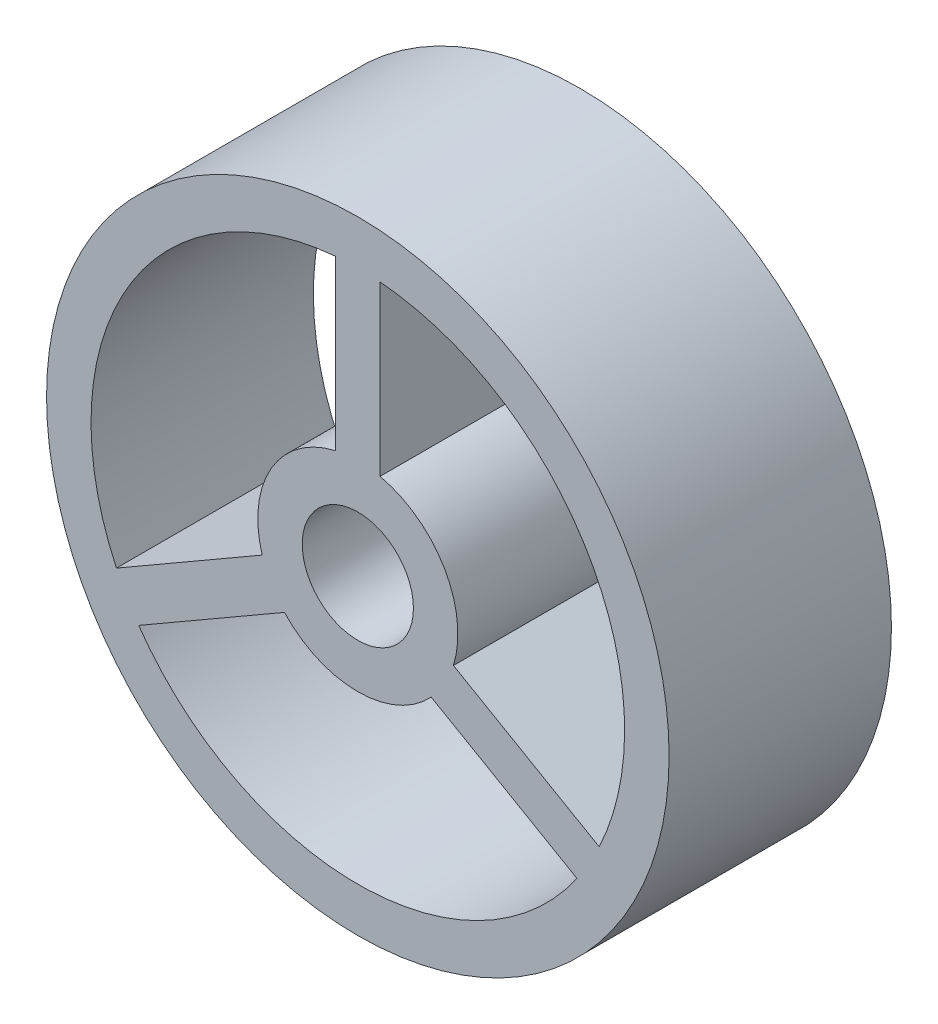
ISO-10303-21;
HEADER;
FILE_DESCRIPTION(('STEP AP214'),'2;1');
FILE_NAME('part.step','',(''),(''),'','','');
FILE_SCHEMA(('AUTOMOTIVE_DESIGN { 1 0 10303 214 1 1 1 1 }'));
ENDSEC;
DATA;
#1=APPLICATION_CONTEXT('core data for automotive mechanical design processes');
#2=APPLICATION_PROTOCOL_DEFINITION('international standard','automotive_design',2000,#1);
#3=PRODUCT_CONTEXT('',#1,'mechanical');
#4=PRODUCT('Part','Part','',(#3));
#5=PRODUCT_RELATED_PRODUCT_CATEGORY('part','',(#4));
#6=PRODUCT_DEFINITION_FORMATION('','',#4);
#7=PRODUCT_DEFINITION_CONTEXT('part definition',#1,'design');
#8=PRODUCT_DEFINITION('design','',#6,#7);
#9=PRODUCT_DEFINITION_SHAPE('','',#8);
#10=(LENGTH_UNIT() NAMED_UNIT(*) SI_UNIT(.MILLI.,.METRE.));
#11=(NAMED_UNIT(*) PLANE_ANGLE_UNIT() SI_UNIT($,.RADIAN.));
#12=(NAMED_UNIT(*) SI_UNIT($,.STERADIAN.) SOLID_ANGLE_UNIT());
#13=UNCERTAINTY_MEASURE_WITH_UNIT(LENGTH_MEASURE(1.E-05),#10,'distance_accuracy_value','');
#14=(GEOMETRIC_REPRESENTATION_CONTEXT(3) GLOBAL_UNCERTAINTY_ASSIGNED_CONTEXT((#13)) GLOBAL_UNIT_ASSIGNED_CONTEXT((#10,
#11,#12)) REPRESENTATION_CONTEXT('',''));
#15=CARTESIAN_POINT('',(0.,0.,0.));
#16=DIRECTION('',(0.,0.,1.));
#17=DIRECTION('',(1.,0.,0.));
#18=AXIS2_PLACEMENT_3D('',#15,#16,#17);
#19=CARTESIAN_POINT('',(0.,0.,10.));
#20=DIRECTION('',(0.,0.,-1.));
#21=DIRECTION('',(-1.,0.,0.));
#22=AXIS2_PLACEMENT_3D('',#19,#20,#21);
#23=CYLINDRICAL_SURFACE('',#22,14.);
#24=CARTESIAN_POINT('',(0.,0.,10.));
#25=DIRECTION('',(0.,0.,1.));
#26=DIRECTION('',(1.,0.,0.));
#27=AXIS2_PLACEMENT_3D('',#24,#25,#26);
#28=CIRCLE('',#27,14.);
#29=CARTESIAN_POINT('',(14.,0.,10.));
#30=VERTEX_POINT('',#29);
#31=EDGE_CURVE('E12',#30,#30,#28,.T.);
#32=ORIENTED_EDGE('',*,*,#31,.F.);
#33=EDGE_LOOP('',(#32));
#34=FACE_BOUND('',#33,.T.);
#35=CARTESIAN_POINT('',(0.,0.,0.));
#36=DIRECTION('',(0.,0.,1.));
#37=DIRECTION('',(1.,0.,0.));
#38=AXIS2_PLACEMENT_3D('',#35,#36,#37);
#39=CIRCLE('',#38,14.);
#40=CARTESIAN_POINT('',(14.,0.,0.));
#41=VERTEX_POINT('',#40);
#42=EDGE_CURVE('E84',#41,#41,#39,.T.);
#43=ORIENTED_EDGE('',*,*,#42,.T.);
#44=EDGE_LOOP('',(#43));
#45=FACE_BOUND('',#44,.T.);
#46=ADVANCED_FACE('F81',(#34,#45),#23,.T.);
#47=CARTESIAN_POINT('',(0.,0.,10.));
#48=DIRECTION('',(0.,0.,1.));
#49=DIRECTION('',(1.,0.,0.));
#50=AXIS2_PLACEMENT_3D('',#47,#48,#49);
#51=PLANE('',#50);
#52=DIRECTION('',(0.866025403784439,-0.5,0.));
#53=VECTOR('',#52,1.);
#54=CARTESIAN_POINT('',(0.500000000000267,0.866025403784901,10.));
#55=LINE('',#54,#53);
#56=CARTESIAN_POINT('',(4.29967103839308,-1.32771569306321,10.));
#57=VERTEX_POINT('',#56);
#58=CARTESIAN_POINT('',(10.8561575886042,-5.11310496776579,10.));
#59=VERTEX_POINT('',#58);
#60=EDGE_CURVE('E95',#57,#59,#55,.T.);
#61=ORIENTED_EDGE('',*,*,#60,.F.);
#62=CARTESIAN_POINT('',(0.,0.,10.));
#63=DIRECTION('',(0.,0.,1.));
#64=DIRECTION('',(1.,0.,0.));
#65=AXIS2_PLACEMENT_3D('',#62,#63,#64);
#66=CIRCLE('',#65,4.5);
#67=CARTESIAN_POINT('',(0.999999999999998,4.38748219369606,10.));
#68=VERTEX_POINT('',#67);
#69=EDGE_CURVE('E211',#57,#68,#66,.T.);
#70=ORIENTED_EDGE('',*,*,#69,.T.);
#71=DIRECTION('',(0.,1.,0.));
#72=VECTOR('',#71,1.);
#73=CARTESIAN_POINT('',(0.999999999999997,0.,10.));
#74=LINE('',#73,#72);
#75=CARTESIAN_POINT('',(1.,11.9582607431014,10.));
#76=VERTEX_POINT('',#75);
#77=EDGE_CURVE('E224',#68,#76,#74,.T.);
#78=ORIENTED_EDGE('',*,*,#77,.T.);
#79=CARTESIAN_POINT('',(0.,0.,10.));
#80=DIRECTION('',(0.,0.,1.));
#81=DIRECTION('',(1.,0.,0.));
#82=AXIS2_PLACEMENT_3D('',#79,#80,#81);
#83=CIRCLE('',#82,12.);
#84=EDGE_CURVE('E221',#59,#76,#83,.T.);
#85=ORIENTED_EDGE('',*,*,#84,.F.);
#86=EDGE_LOOP('',(#61,#70,#78,#85));
#87=FACE_BOUND('',#86,.T.);
#88=DIRECTION('',(-0.866025403784439,-0.5,0.));
#89=VECTOR('',#88,1.);
#90=CARTESIAN_POINT('',(0.500000000000206,-0.866025403784794,10.));
#91=LINE('',#90,#89);
#92=CARTESIAN_POINT('',(-3.29967103839213,-3.05976650063264,10.));
#93=VERTEX_POINT('',#92);
#94=CARTESIAN_POINT('',(-9.85615758860374,-6.8451557753355,10.));
#95=VERTEX_POINT('',#94);
#96=EDGE_CURVE('E103',#93,#95,#91,.T.);
#97=ORIENTED_EDGE('',*,*,#96,.F.);
#98=CARTESIAN_POINT('',(0.,0.,10.));
#99=DIRECTION('',(0.,0.,1.));
#100=DIRECTION('',(1.,0.,0.));
#101=AXIS2_PLACEMENT_3D('',#98,#99,#100);
#102=CIRCLE('',#101,4.5);
#103=CARTESIAN_POINT('',(3.29967103839308,-3.05976650063209,10.));
#104=VERTEX_POINT('',#103);
#105=EDGE_CURVE('E189',#93,#104,#102,.T.);
#106=ORIENTED_EDGE('',*,*,#105,.T.);
#107=DIRECTION('',(0.866025403784439,-0.5,0.));
#108=VECTOR('',#107,1.);
#109=CARTESIAN_POINT('',(-0.499999999999733,-0.866025403783976,10.));
#110=LINE('',#109,#108);
#111=CARTESIAN_POINT('',(9.8561575886044,-6.84515577533476,10.));
#112=VERTEX_POINT('',#111);
#113=EDGE_CURVE('E192',#104,#112,#110,.T.);
#114=ORIENTED_EDGE('',*,*,#113,.T.);
#115=CARTESIAN_POINT('',(0.,0.,10.));
#116=DIRECTION('',(0.,0.,1.));
#117=DIRECTION('',(1.,0.,0.));
#118=AXIS2_PLACEMENT_3D('',#115,#116,#117);
#119=CIRCLE('',#118,12.);
#120=EDGE_CURVE('E198',#95,#112,#119,.T.);
#121=ORIENTED_EDGE('',*,*,#120,.F.);
#122=EDGE_LOOP('',(#97,#106,#114,#121));
#123=FACE_BOUND('',#122,.T.);
#124=DIRECTION('',(0.,1.,0.));
#125=VECTOR('',#124,1.);
#126=CARTESIAN_POINT('',(-1.,0.,10.));
#127=LINE('',#126,#125);
#128=CARTESIAN_POINT('',(-1.,4.38748219369606,10.));
#129=VERTEX_POINT('',#128);
#130=CARTESIAN_POINT('',(-1.,11.9582607431014,10.));
#131=VERTEX_POINT('',#130);
#132=EDGE_CURVE('E231',#129,#131,#127,.T.);
#133=ORIENTED_EDGE('',*,*,#132,.F.);
#134=CARTESIAN_POINT('',(0.,0.,10.));
#135=DIRECTION('',(0.,0.,1.));
#136=DIRECTION('',(1.,0.,0.));
#137=AXIS2_PLACEMENT_3D('',#134,#135,#136);
#138=CIRCLE('',#137,4.5);
#139=CARTESIAN_POINT('',(-4.29967103839214,-1.32771569306376,10.));
#140=VERTEX_POINT('',#139);
#141=EDGE_CURVE('E241',#129,#140,#138,.T.);
#142=ORIENTED_EDGE('',*,*,#141,.T.);
#143=DIRECTION('',(-0.866025403784439,-0.5,0.));
#144=VECTOR('',#143,1.);
#145=CARTESIAN_POINT('',(-0.499999999999794,0.866025403784082,10.));
#146=LINE('',#145,#144);
#147=CARTESIAN_POINT('',(-10.8561575886035,-5.11310496776643,10.));
#148=VERTEX_POINT('',#147);
#149=EDGE_CURVE('E254',#140,#148,#146,.T.);
#150=ORIENTED_EDGE('',*,*,#149,.T.);
#151=CARTESIAN_POINT('',(0.,0.,10.));
#152=DIRECTION('',(0.,0.,1.));
#153=DIRECTION('',(1.,0.,0.));
#154=AXIS2_PLACEMENT_3D('',#151,#152,#153);
#155=CIRCLE('',#154,12.);
#156=EDGE_CURVE('E251',#131,#148,#155,.T.);
#157=ORIENTED_EDGE('',*,*,#156,.F.);
#158=EDGE_LOOP('',(#133,#142,#150,#157));
#159=FACE_BOUND('',#158,.T.);
#160=CARTESIAN_POINT('',(0.,0.,10.));
#161=DIRECTION('',(0.,0.,1.));
#162=DIRECTION('',(1.,0.,0.));
#163=AXIS2_PLACEMENT_3D('',#160,#161,#162);
#164=CIRCLE('',#163,2.5);
#165=CARTESIAN_POINT('',(2.5,0.,10.));
#166=VERTEX_POINT('',#165);
#167=EDGE_CURVE('E261',#166,#166,#164,.T.);
#168=ORIENTED_EDGE('',*,*,#167,.F.);
#169=EDGE_LOOP('',(#168));
#170=FACE_BOUND('',#169,.T.);
#171=ORIENTED_EDGE('',*,*,#31,.T.);
#172=EDGE_LOOP('',(#171));
#173=FACE_BOUND('',#172,.T.);
#174=ADVANCED_FACE('F276',(#87,#123,#159,#170,#173),#51,.T.);
#175=CARTESIAN_POINT('',(0.,0.,0.));
#176=DIRECTION('',(0.,0.,1.));
#177=DIRECTION('',(1.,0.,0.));
#178=AXIS2_PLACEMENT_3D('',#175,#176,#177);
#179=PLANE('',#178);
#180=CARTESIAN_POINT('',(0.,0.,0.));
#181=DIRECTION('',(0.,0.,1.));
#182=DIRECTION('',(1.,0.,0.));
#183=AXIS2_PLACEMENT_3D('',#180,#181,#182);
#184=CIRCLE('',#183,4.5);
#185=CARTESIAN_POINT('',(4.29967103839308,-1.32771569306321,0.));
#186=VERTEX_POINT('',#185);
#187=CARTESIAN_POINT('',(0.999999999999998,4.38748219369606,0.));
#188=VERTEX_POINT('',#187);
#189=EDGE_CURVE('E217',#186,#188,#184,.T.);
#190=ORIENTED_EDGE('',*,*,#189,.F.);
#191=DIRECTION('',(0.866025403784439,-0.5,0.));
#192=VECTOR('',#191,1.);
#193=CARTESIAN_POINT('',(0.500000000000267,0.866025403784901,0.));
#194=LINE('',#193,#192);
#195=CARTESIAN_POINT('',(10.8561575886044,-5.11310496776588,0.));
#196=VERTEX_POINT('',#195);
#197=EDGE_CURVE('E207',#186,#196,#194,.T.);
#198=ORIENTED_EDGE('',*,*,#197,.T.);
#199=CARTESIAN_POINT('',(0.,0.,0.));
#200=DIRECTION('',(0.,0.,1.));
#201=DIRECTION('',(1.,0.,0.));
#202=AXIS2_PLACEMENT_3D('',#199,#200,#201);
#203=CIRCLE('',#202,12.);
#204=CARTESIAN_POINT('',(1.,11.9582607431014,0.));
#205=VERTEX_POINT('',#204);
#206=EDGE_CURVE('E210',#196,#205,#203,.T.);
#207=ORIENTED_EDGE('',*,*,#206,.T.);
#208=DIRECTION('',(0.,1.,0.));
#209=VECTOR('',#208,1.);
#210=CARTESIAN_POINT('',(0.999999999999997,0.,0.));
#211=LINE('',#210,#209);
#212=EDGE_CURVE('E214',#188,#205,#211,.T.);
#213=ORIENTED_EDGE('',*,*,#212,.F.);
#214=EDGE_LOOP('',(#190,#198,#207,#213));
#215=FACE_BOUND('',#214,.T.);
#216=CARTESIAN_POINT('',(0.,0.,0.));
#217=DIRECTION('',(0.,0.,1.));
#218=DIRECTION('',(1.,0.,0.));
#219=AXIS2_PLACEMENT_3D('',#216,#217,#218);
#220=CIRCLE('',#219,4.5);
#221=CARTESIAN_POINT('',(-3.29967103839213,-3.05976650063264,0.));
#222=VERTEX_POINT('',#221);
#223=CARTESIAN_POINT('',(3.29967103839308,-3.05976650063209,0.));
#224=VERTEX_POINT('',#223);
#225=EDGE_CURVE('E177',#222,#224,#220,.T.);
#226=ORIENTED_EDGE('',*,*,#225,.F.);
#227=DIRECTION('',(-0.866025403784439,-0.5,0.));
#228=VECTOR('',#227,1.);
#229=CARTESIAN_POINT('',(0.500000000000206,-0.866025403784794,0.));
#230=LINE('',#229,#228);
#231=CARTESIAN_POINT('',(-9.85615758860346,-6.84515577533531,0.));
#232=VERTEX_POINT('',#231);
#233=EDGE_CURVE('E171',#222,#232,#230,.T.);
#234=ORIENTED_EDGE('',*,*,#233,.T.);
#235=CARTESIAN_POINT('',(0.,0.,0.));
#236=DIRECTION('',(0.,0.,1.));
#237=DIRECTION('',(1.,0.,0.));
#238=AXIS2_PLACEMENT_3D('',#235,#236,#237);
#239=CIRCLE('',#238,12.);
#240=CARTESIAN_POINT('',(9.8561575886043,-6.84515577533469,0.));
#241=VERTEX_POINT('',#240);
#242=EDGE_CURVE('E180',#232,#241,#239,.T.);
#243=ORIENTED_EDGE('',*,*,#242,.T.);
#244=DIRECTION('',(0.866025403784439,-0.5,0.));
#245=VECTOR('',#244,1.);
#246=CARTESIAN_POINT('',(-0.499999999999733,-0.866025403783976,0.));
#247=LINE('',#246,#245);
#248=EDGE_CURVE('E185',#224,#241,#247,.T.);
#249=ORIENTED_EDGE('',*,*,#248,.F.);
#250=EDGE_LOOP('',(#226,#234,#243,#249));
#251=FACE_BOUND('',#250,.T.);
#252=CARTESIAN_POINT('',(0.,0.,0.));
#253=DIRECTION('',(0.,0.,1.));
#254=DIRECTION('',(1.,0.,0.));
#255=AXIS2_PLACEMENT_3D('',#252,#253,#254);
#256=CIRCLE('',#255,4.5);
#257=CARTESIAN_POINT('',(-1.,4.38748219369606,0.));
#258=VERTEX_POINT('',#257);
#259=CARTESIAN_POINT('',(-4.29967103839214,-1.32771569306376,0.));
#260=VERTEX_POINT('',#259);
#261=EDGE_CURVE('E247',#258,#260,#256,.T.);
#262=ORIENTED_EDGE('',*,*,#261,.F.);
#263=DIRECTION('',(0.,1.,0.));
#264=VECTOR('',#263,1.);
#265=CARTESIAN_POINT('',(-1.,0.,0.));
#266=LINE('',#265,#264);
#267=CARTESIAN_POINT('',(-1.,11.9582607431014,0.));
#268=VERTEX_POINT('',#267);
#269=EDGE_CURVE('E237',#258,#268,#266,.T.);
#270=ORIENTED_EDGE('',*,*,#269,.T.);
#271=CARTESIAN_POINT('',(0.,0.,0.));
#272=DIRECTION('',(0.,0.,1.));
#273=DIRECTION('',(1.,0.,0.));
#274=AXIS2_PLACEMENT_3D('',#271,#272,#273);
#275=CIRCLE('',#274,12.);
#276=CARTESIAN_POINT('',(-10.8561575886038,-5.1131049677666,0.));
#277=VERTEX_POINT('',#276);
#278=EDGE_CURVE('E240',#268,#277,#275,.T.);
#279=ORIENTED_EDGE('',*,*,#278,.T.);
#280=DIRECTION('',(-0.866025403784439,-0.5,0.));
#281=VECTOR('',#280,1.);
#282=CARTESIAN_POINT('',(-0.499999999999794,0.866025403784082,0.));
#283=LINE('',#282,#281);
#284=EDGE_CURVE('E244',#260,#277,#283,.T.);
#285=ORIENTED_EDGE('',*,*,#284,.F.);
#286=EDGE_LOOP('',(#262,#270,#279,#285));
#287=FACE_BOUND('',#286,.T.);
#288=CARTESIAN_POINT('',(0.,0.,0.));
#289=DIRECTION('',(0.,0.,1.));
#290=DIRECTION('',(1.,0.,0.));
#291=AXIS2_PLACEMENT_3D('',#288,#289,#290);
#292=CIRCLE('',#291,2.5);
#293=CARTESIAN_POINT('',(2.5,0.,0.));
#294=VERTEX_POINT('',#293);
#295=EDGE_CURVE('E268',#294,#294,#292,.T.);
#296=ORIENTED_EDGE('',*,*,#295,.T.);
#297=EDGE_LOOP('',(#296));
#298=FACE_BOUND('',#297,.T.);
#299=ORIENTED_EDGE('',*,*,#42,.F.);
#300=EDGE_LOOP('',(#299));
#301=FACE_BOUND('',#300,.T.);
#302=ADVANCED_FACE('F187',(#215,#251,#287,#298,#301),#179,.F.);
#303=CARTESIAN_POINT('',(0.,0.,0.));
#304=DIRECTION('',(0.,0.,1.));
#305=DIRECTION('',(1.,0.,0.));
#306=AXIS2_PLACEMENT_3D('',#303,#304,#305);
#307=CYLINDRICAL_SURFACE('',#306,2.5);
#308=ORIENTED_EDGE('',*,*,#295,.F.);
#309=EDGE_LOOP('',(#308));
#310=FACE_BOUND('',#309,.T.);
#311=ORIENTED_EDGE('',*,*,#167,.T.);
#312=EDGE_LOOP('',(#311));
#313=FACE_BOUND('',#312,.T.);
#314=ADVANCED_FACE('F274',(#310,#313),#307,.F.);
#315=CARTESIAN_POINT('',(-1.,0.,0.));
#316=DIRECTION('',(1.,0.,0.));
#317=DIRECTION('',(0.,1.,0.));
#318=AXIS2_PLACEMENT_3D('',#315,#316,#317);
#319=PLANE('',#318);
#320=ORIENTED_EDGE('',*,*,#132,.T.);
#321=DIRECTION('',(0.,0.,1.));
#322=VECTOR('',#321,1.);
#323=CARTESIAN_POINT('',(-1.,11.9582607431014,0.));
#324=LINE('',#323,#322);
#325=EDGE_CURVE('E249',#268,#131,#324,.T.);
#326=ORIENTED_EDGE('',*,*,#325,.F.);
#327=ORIENTED_EDGE('',*,*,#269,.F.);
#328=DIRECTION('',(0.,0.,1.));
#329=VECTOR('',#328,1.);
#330=CARTESIAN_POINT('',(-1.,4.38748219369606,0.));
#331=LINE('',#330,#329);
#332=EDGE_CURVE('E259',#258,#129,#331,.T.);
#333=ORIENTED_EDGE('',*,*,#332,.T.);
#334=EDGE_LOOP('',(#320,#326,#327,#333));
#335=FACE_BOUND('',#334,.T.);
#336=ADVANCED_FACE('F293',(#335),#319,.F.);
#337=CARTESIAN_POINT('',(0.,0.,0.));
#338=DIRECTION('',(0.,0.,1.));
#339=DIRECTION('',(1.,0.,0.));
#340=AXIS2_PLACEMENT_3D('',#337,#338,#339);
#341=CYLINDRICAL_SURFACE('',#340,4.5);
#342=ORIENTED_EDGE('',*,*,#141,.F.);
#343=ORIENTED_EDGE('',*,*,#332,.F.);
#344=ORIENTED_EDGE('',*,*,#261,.T.);
#345=DIRECTION('',(0.,0.,1.));
#346=VECTOR('',#345,1.);
#347=CARTESIAN_POINT('',(-4.29967103839214,-1.32771569306376,0.));
#348=LINE('',#347,#346);
#349=EDGE_CURVE('E262',#260,#140,#348,.T.);
#350=ORIENTED_EDGE('',*,*,#349,.T.);
#351=EDGE_LOOP('',(#342,#343,#344,#350));
#352=FACE_BOUND('',#351,.T.);
#353=ADVANCED_FACE('F300',(#352),#341,.T.);
#354=CARTESIAN_POINT('',(-0.499999999999794,0.866025403784082,0.));
#355=DIRECTION('',(-0.5,0.866025403784439,0.));
#356=DIRECTION('',(-0.866025403784439,-0.5,0.));
#357=AXIS2_PLACEMENT_3D('',#354,#355,#356);
#358=PLANE('',#357);
#359=ORIENTED_EDGE('',*,*,#149,.F.);
#360=ORIENTED_EDGE('',*,*,#349,.F.);
#361=ORIENTED_EDGE('',*,*,#284,.T.);
#362=DIRECTION('',(0.,0.,1.));
#363=VECTOR('',#362,1.);
#364=CARTESIAN_POINT('',(-10.8561575886035,-5.11310496776643,0.));
#365=LINE('',#364,#363);
#366=EDGE_CURVE('E264',#277,#148,#365,.T.);
#367=ORIENTED_EDGE('',*,*,#366,.T.);
#368=EDGE_LOOP('',(#359,#360,#361,#367));
#369=FACE_BOUND('',#368,.T.);
#370=ADVANCED_FACE('F305',(#369),#358,.T.);
#371=CARTESIAN_POINT('',(0.,0.,0.));
#372=DIRECTION('',(0.,0.,1.));
#373=DIRECTION('',(1.,0.,0.));
#374=AXIS2_PLACEMENT_3D('',#371,#372,#373);
#375=CYLINDRICAL_SURFACE('',#374,12.);
#376=ORIENTED_EDGE('',*,*,#156,.T.);
#377=ORIENTED_EDGE('',*,*,#366,.F.);
#378=ORIENTED_EDGE('',*,*,#278,.F.);
#379=ORIENTED_EDGE('',*,*,#325,.T.);
#380=EDGE_LOOP('',(#376,#377,#378,#379));
#381=FACE_BOUND('',#380,.T.);
#382=ADVANCED_FACE('F302',(#381),#375,.F.);
#383=CARTESIAN_POINT('',(0.500000000000206,-0.866025403784794,0.));
#384=DIRECTION('',(-0.5,0.866025403784438,0.));
#385=DIRECTION('',(-0.866025403784439,-0.5,0.));
#386=AXIS2_PLACEMENT_3D('',#383,#384,#385);
#387=PLANE('',#386);
#388=ORIENTED_EDGE('',*,*,#96,.T.);
#389=DIRECTION('',(0.,0.,1.));
#390=VECTOR('',#389,1.);
#391=CARTESIAN_POINT('',(-9.85615758860346,-6.84515577533531,0.));
#392=LINE('',#391,#390);
#393=EDGE_CURVE('E167',#232,#95,#392,.T.);
#394=ORIENTED_EDGE('',*,*,#393,.F.);
#395=ORIENTED_EDGE('',*,*,#233,.F.);
#396=DIRECTION('',(0.,0.,1.));
#397=VECTOR('',#396,1.);
#398=CARTESIAN_POINT('',(-3.29967103839213,-3.05976650063264,0.));
#399=LINE('',#398,#397);
#400=EDGE_CURVE('E202',#222,#93,#399,.T.);
#401=ORIENTED_EDGE('',*,*,#400,.T.);
#402=EDGE_LOOP('',(#388,#394,#395,#401));
#403=FACE_BOUND('',#402,.T.);
#404=ADVANCED_FACE('F169',(#403),#387,.F.);
#405=CARTESIAN_POINT('',(0.,0.,0.));
#406=DIRECTION('',(0.,0.,1.));
#407=DIRECTION('',(1.,0.,0.));
#408=AXIS2_PLACEMENT_3D('',#405,#406,#407);
#409=CYLINDRICAL_SURFACE('',#408,4.5);
#410=ORIENTED_EDGE('',*,*,#105,.F.);
#411=ORIENTED_EDGE('',*,*,#400,.F.);
#412=ORIENTED_EDGE('',*,*,#225,.T.);
#413=DIRECTION('',(0.,0.,1.));
#414=VECTOR('',#413,1.);
#415=CARTESIAN_POINT('',(3.29967103839308,-3.05976650063209,0.));
#416=LINE('',#415,#414);
#417=EDGE_CURVE('E204',#224,#104,#416,.T.);
#418=ORIENTED_EDGE('',*,*,#417,.T.);
#419=EDGE_LOOP('',(#410,#411,#412,#418));
#420=FACE_BOUND('',#419,.T.);
#421=ADVANCED_FACE('F330',(#420),#409,.T.);
#422=CARTESIAN_POINT('',(-0.499999999999733,-0.866025403783976,0.));
#423=DIRECTION('',(-0.5,-0.866025403784439,0.));
#424=DIRECTION('',(0.866025403784439,-0.5,0.));
#425=AXIS2_PLACEMENT_3D('',#422,#423,#424);
#426=PLANE('',#425);
#427=ORIENTED_EDGE('',*,*,#113,.F.);
#428=ORIENTED_EDGE('',*,*,#417,.F.);
#429=ORIENTED_EDGE('',*,*,#248,.T.);
#430=DIRECTION('',(0.,0.,1.));
#431=VECTOR('',#430,1.);
#432=CARTESIAN_POINT('',(9.8561575886044,-6.84515577533476,0.));
#433=LINE('',#432,#431);
#434=EDGE_CURVE('E176',#241,#112,#433,.T.);
#435=ORIENTED_EDGE('',*,*,#434,.T.);
#436=EDGE_LOOP('',(#427,#428,#429,#435));
#437=FACE_BOUND('',#436,.T.);
#438=ADVANCED_FACE('F333',(#437),#426,.T.);
#439=CARTESIAN_POINT('',(0.,0.,0.));
#440=DIRECTION('',(0.,0.,1.));
#441=DIRECTION('',(1.,0.,0.));
#442=AXIS2_PLACEMENT_3D('',#439,#440,#441);
#443=CYLINDRICAL_SURFACE('',#442,12.);
#444=ORIENTED_EDGE('',*,*,#120,.T.);
#445=ORIENTED_EDGE('',*,*,#434,.F.);
#446=ORIENTED_EDGE('',*,*,#242,.F.);
#447=ORIENTED_EDGE('',*,*,#393,.T.);
#448=EDGE_LOOP('',(#444,#445,#446,#447));
#449=FACE_BOUND('',#448,.T.);
#450=ADVANCED_FACE('F181',(#449),#443,.F.);
#451=CARTESIAN_POINT('',(0.500000000000267,0.866025403784901,0.));
#452=DIRECTION('',(-0.5,-0.866025403784439,0.));
#453=DIRECTION('',(0.866025403784439,-0.5,0.));
#454=AXIS2_PLACEMENT_3D('',#451,#452,#453);
#455=PLANE('',#454);
#456=ORIENTED_EDGE('',*,*,#60,.T.);
#457=DIRECTION('',(0.,0.,1.));
#458=VECTOR('',#457,1.);
#459=CARTESIAN_POINT('',(10.8561575886044,-5.11310496776588,0.));
#460=LINE('',#459,#458);
#461=EDGE_CURVE('E219',#196,#59,#460,.T.);
#462=ORIENTED_EDGE('',*,*,#461,.F.);
#463=ORIENTED_EDGE('',*,*,#197,.F.);
#464=DIRECTION('',(0.,0.,1.));
#465=VECTOR('',#464,1.);
#466=CARTESIAN_POINT('',(4.29967103839308,-1.32771569306321,0.));
#467=LINE('',#466,#465);
#468=EDGE_CURVE('E229',#186,#57,#467,.T.);
#469=ORIENTED_EDGE('',*,*,#468,.T.);
#470=EDGE_LOOP('',(#456,#462,#463,#469));
#471=FACE_BOUND('',#470,.T.);
#472=ADVANCED_FACE('F313',(#471),#455,.F.);
#473=CARTESIAN_POINT('',(0.,0.,0.));
#474=DIRECTION('',(0.,0.,1.));
#475=DIRECTION('',(1.,0.,0.));
#476=AXIS2_PLACEMENT_3D('',#473,#474,#475);
#477=CYLINDRICAL_SURFACE('',#476,4.5);
#478=ORIENTED_EDGE('',*,*,#69,.F.);
#479=ORIENTED_EDGE('',*,*,#468,.F.);
#480=ORIENTED_EDGE('',*,*,#189,.T.);
#481=DIRECTION('',(0.,0.,1.));
#482=VECTOR('',#481,1.);
#483=CARTESIAN_POINT('',(0.999999999999998,4.38748219369606,0.));
#484=LINE('',#483,#482);
#485=EDGE_CURVE('E232',#188,#68,#484,.T.);
#486=ORIENTED_EDGE('',*,*,#485,.T.);
#487=EDGE_LOOP('',(#478,#479,#480,#486));
#488=FACE_BOUND('',#487,.T.);
#489=ADVANCED_FACE('F316',(#488),#477,.T.);
#490=CARTESIAN_POINT('',(0.999999999999997,0.,0.));
#491=DIRECTION('',(1.,0.,0.));
#492=DIRECTION('',(0.,1.,0.));
#493=AXIS2_PLACEMENT_3D('',#490,#491,#492);
#494=PLANE('',#493);
#495=ORIENTED_EDGE('',*,*,#77,.F.);
#496=ORIENTED_EDGE('',*,*,#485,.F.);
#497=ORIENTED_EDGE('',*,*,#212,.T.);
#498=DIRECTION('',(0.,0.,1.));
#499=VECTOR('',#498,1.);
#500=CARTESIAN_POINT('',(1.,11.9582607431014,0.));
#501=LINE('',#500,#499);
#502=EDGE_CURVE('E234',#205,#76,#501,.T.);
#503=ORIENTED_EDGE('',*,*,#502,.T.);
#504=EDGE_LOOP('',(#495,#496,#497,#503));
#505=FACE_BOUND('',#504,.T.);
#506=ADVANCED_FACE('F320',(#505),#494,.T.);
#507=CARTESIAN_POINT('',(0.,0.,0.));
#508=DIRECTION('',(0.,0.,1.));
#509=DIRECTION('',(1.,0.,0.));
#510=AXIS2_PLACEMENT_3D('',#507,#508,#509);
#511=CYLINDRICAL_SURFACE('',#510,12.);
#512=ORIENTED_EDGE('',*,*,#84,.T.);
#513=ORIENTED_EDGE('',*,*,#502,.F.);
#514=ORIENTED_EDGE('',*,*,#206,.F.);
#515=ORIENTED_EDGE('',*,*,#461,.T.);
#516=EDGE_LOOP('',(#512,#513,#514,#515));
#517=FACE_BOUND('',#516,.T.);
#518=ADVANCED_FACE('F317',(#517),#511,.F.);
#519=CLOSED_SHELL('',(#46,#174,#302,#314,#336,#353,#370,#382,#404,#421,#438,#450,#472,#489,#506,#518));
#520=MANIFOLD_SOLID_BREP('B2',#519);
#521=ADVANCED_BREP_SHAPE_REPRESENTATION('',(#18,#520),#14);
#522=SHAPE_DEFINITION_REPRESENTATION(#9,#521);
ENDSEC;
END-ISO-10303-21;
